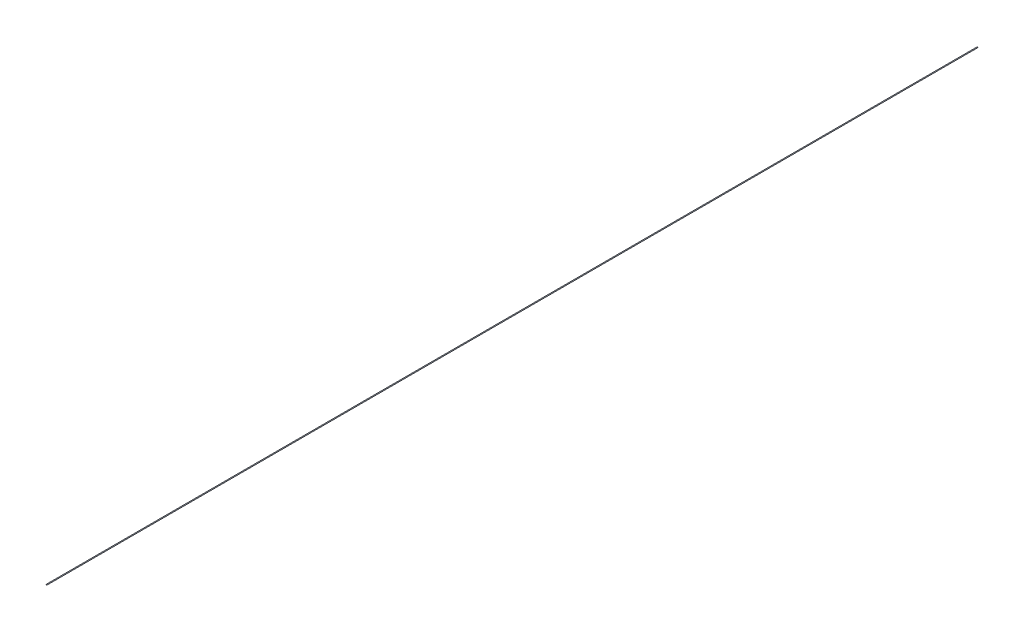
ISO-10303-21;
HEADER;
FILE_DESCRIPTION(('STEP AP214'),'2;1');
FILE_NAME('part.step','',(''),(''),'','','');
FILE_SCHEMA(('AUTOMOTIVE_DESIGN { 1 0 10303 214 1 1 1 1 }'));
ENDSEC;
DATA;
#1=APPLICATION_CONTEXT('core data for automotive mechanical design processes');
#2=APPLICATION_PROTOCOL_DEFINITION('international standard','automotive_design',2000,#1);
#3=PRODUCT_CONTEXT('',#1,'mechanical');
#4=PRODUCT('Part','Part','',(#3));
#5=PRODUCT_RELATED_PRODUCT_CATEGORY('part','',(#4));
#6=PRODUCT_DEFINITION_FORMATION('','',#4);
#7=PRODUCT_DEFINITION_CONTEXT('part definition',#1,'design');
#8=PRODUCT_DEFINITION('design','',#6,#7);
#9=PRODUCT_DEFINITION_SHAPE('','',#8);
#10=(LENGTH_UNIT() NAMED_UNIT(*) SI_UNIT(.MILLI.,.METRE.));
#11=(NAMED_UNIT(*) PLANE_ANGLE_UNIT() SI_UNIT($,.RADIAN.));
#12=(NAMED_UNIT(*) SI_UNIT($,.STERADIAN.) SOLID_ANGLE_UNIT());
#13=UNCERTAINTY_MEASURE_WITH_UNIT(LENGTH_MEASURE(1.E-05),#10,'distance_accuracy_value','');
#14=(GEOMETRIC_REPRESENTATION_CONTEXT(3) GLOBAL_UNCERTAINTY_ASSIGNED_CONTEXT((#13)) GLOBAL_UNIT_ASSIGNED_CONTEXT((#10,
#11,#12)) REPRESENTATION_CONTEXT('',''));
#15=CARTESIAN_POINT('',(0.,0.,0.));
#16=DIRECTION('',(0.,0.,1.));
#17=DIRECTION('',(1.,0.,0.));
#18=AXIS2_PLACEMENT_3D('',#15,#16,#17);
#19=CARTESIAN_POINT('',(0.,0.,7620.));
#20=DIRECTION('',(0.,0.,-1.));
#21=DIRECTION('',(-1.,0.,0.));
#22=AXIS2_PLACEMENT_3D('',#19,#20,#21);
#23=CYLINDRICAL_SURFACE('',#22,3.175);
#24=CARTESIAN_POINT('',(0.,0.,7620.));
#25=DIRECTION('',(0.,0.,1.));
#26=DIRECTION('',(1.,0.,0.));
#27=AXIS2_PLACEMENT_3D('',#24,#25,#26);
#28=CIRCLE('',#27,3.175);
#29=CARTESIAN_POINT('',(-3.175,0.,7620.));
#30=VERTEX_POINT('',#29);
#31=EDGE_CURVE('E10',#30,#30,#28,.T.);
#32=CARTESIAN_POINT('',(0.,0.,0.));
#33=DIRECTION('',(0.,0.,1.));
#34=DIRECTION('',(1.,0.,0.));
#35=AXIS2_PLACEMENT_3D('',#32,#33,#34);
#36=CIRCLE('',#35,3.175);
#37=CARTESIAN_POINT('',(-3.175,0.,-8.88178419700125E-13));
#38=VERTEX_POINT('',#37);
#39=EDGE_CURVE('E33',#38,#38,#36,.T.);
#40=CARTESIAN_POINT('',(-3.175,0.,7620.));
#41=CARTESIAN_POINT('',(-3.175,0.,7540.625));
#42=CARTESIAN_POINT('',(-3.175,0.,7461.25));
#43=CARTESIAN_POINT('',(-3.175,0.,7302.5));
#44=CARTESIAN_POINT('',(-3.175,0.,7223.125));
#45=CARTESIAN_POINT('',(-3.175,0.,7064.375));
#46=CARTESIAN_POINT('',(-3.175,0.,6985.));
#47=CARTESIAN_POINT('',(-3.175,0.,6826.25));
#48=CARTESIAN_POINT('',(-3.175,0.,6746.875));
#49=CARTESIAN_POINT('',(-3.175,0.,6588.125));
#50=CARTESIAN_POINT('',(-3.175,0.,6508.75));
#51=CARTESIAN_POINT('',(-3.175,0.,6350.));
#52=CARTESIAN_POINT('',(-3.175,0.,6270.625));
#53=CARTESIAN_POINT('',(-3.175,0.,6111.875));
#54=CARTESIAN_POINT('',(-3.175,0.,6032.5));
#55=CARTESIAN_POINT('',(-3.175,0.,5873.75));
#56=CARTESIAN_POINT('',(-3.175,0.,5794.375));
#57=CARTESIAN_POINT('',(-3.175,0.,5635.625));
#58=CARTESIAN_POINT('',(-3.175,0.,5556.25));
#59=CARTESIAN_POINT('',(-3.175,0.,5397.5));
#60=CARTESIAN_POINT('',(-3.175,0.,5318.125));
#61=CARTESIAN_POINT('',(-3.175,0.,5159.375));
#62=CARTESIAN_POINT('',(-3.175,0.,5080.));
#63=CARTESIAN_POINT('',(-3.175,0.,4921.25));
#64=CARTESIAN_POINT('',(-3.175,0.,4841.875));
#65=CARTESIAN_POINT('',(-3.175,0.,4683.125));
#66=CARTESIAN_POINT('',(-3.175,0.,4603.75));
#67=CARTESIAN_POINT('',(-3.175,0.,4445.));
#68=CARTESIAN_POINT('',(-3.175,0.,4365.625));
#69=CARTESIAN_POINT('',(-3.175,0.,4206.875));
#70=CARTESIAN_POINT('',(-3.175,0.,4127.5));
#71=CARTESIAN_POINT('',(-3.175,0.,3968.75));
#72=CARTESIAN_POINT('',(-3.175,0.,3889.375));
#73=CARTESIAN_POINT('',(-3.175,0.,3730.625));
#74=CARTESIAN_POINT('',(-3.175,0.,3651.25));
#75=CARTESIAN_POINT('',(-3.175,0.,3492.5));
#76=CARTESIAN_POINT('',(-3.175,0.,3413.125));
#77=CARTESIAN_POINT('',(-3.175,0.,3254.375));
#78=CARTESIAN_POINT('',(-3.175,0.,3175.));
#79=CARTESIAN_POINT('',(-3.175,0.,3016.25));
#80=CARTESIAN_POINT('',(-3.175,0.,2936.875));
#81=CARTESIAN_POINT('',(-3.175,0.,2778.125));
#82=CARTESIAN_POINT('',(-3.175,0.,2698.75));
#83=CARTESIAN_POINT('',(-3.175,0.,2540.));
#84=CARTESIAN_POINT('',(-3.175,0.,2460.625));
#85=CARTESIAN_POINT('',(-3.175,0.,2301.875));
#86=CARTESIAN_POINT('',(-3.175,0.,2222.5));
#87=CARTESIAN_POINT('',(-3.175,0.,2063.75));
#88=CARTESIAN_POINT('',(-3.175,0.,1984.375));
#89=CARTESIAN_POINT('',(-3.175,0.,1825.625));
#90=CARTESIAN_POINT('',(-3.175,0.,1746.25));
#91=CARTESIAN_POINT('',(-3.175,0.,1587.5));
#92=CARTESIAN_POINT('',(-3.175,0.,1508.125));
#93=CARTESIAN_POINT('',(-3.175,0.,1349.375));
#94=CARTESIAN_POINT('',(-3.175,0.,1270.));
#95=CARTESIAN_POINT('',(-3.175,0.,1111.25));
#96=CARTESIAN_POINT('',(-3.175,0.,1031.875));
#97=CARTESIAN_POINT('',(-3.175,0.,873.125));
#98=CARTESIAN_POINT('',(-3.175,0.,793.75));
#99=CARTESIAN_POINT('',(-3.175,0.,635.));
#100=CARTESIAN_POINT('',(-3.175,0.,555.624999999999));
#101=CARTESIAN_POINT('',(-3.175,0.,396.874999999999));
#102=CARTESIAN_POINT('',(-3.175,0.,317.499999999999));
#103=CARTESIAN_POINT('',(-3.175,0.,158.749999999999));
#104=CARTESIAN_POINT('',(-3.175,0.,79.3749999999992));
#105=CARTESIAN_POINT('',(-3.175,0.,-8.88178419700125E-13));
#106=B_SPLINE_CURVE_WITH_KNOTS('',3,(#40,#41,#42,#43,#44,#45,#46,#47,#48,#49,#50,#51,#52,#53,
#54,#55,#56,#57,#58,#59,#60,#61,#62,#63,#64,#65,#66,#67,#68,#69,#70,#71,#72,#73,#74,#75,#76,#77,
#78,#79,#80,#81,#82,#83,#84,#85,#86,#87,#88,#89,#90,#91,#92,#93,#94,#95,#96,#97,#98,#99,#100,
#101,#102,#103,#104,#105),.UNSPECIFIED.,.F.,.F.,(4,2,2,2,2,2,2,2,2,2,2,2,2,2,2,2,2,2,2,2,2,2,2,
2,2,2,2,2,2,2,2,2,4),(0.,238.124999999999,476.249999999999,714.375,952.5,1190.625,1428.75,
1666.875,1905.,2143.125,2381.25,2619.375,2857.5,3095.625,3333.75,3571.875,3810.,4048.125,
4286.25,4524.375,4762.5,5000.625,5238.75,5476.875,5715.,5953.125,6191.25,6429.375,6667.5,
6905.625,7143.75,7381.875,7620.),.UNSPECIFIED.);
#107=EDGE_CURVE('BSEAM30',#30,#38,#106,.T.);
#108=ORIENTED_EDGE('',*,*,#31,.F.);
#109=ORIENTED_EDGE('',*,*,#39,.T.);
#110=ORIENTED_EDGE('',*,*,#107,.T.);
#111=ORIENTED_EDGE('',*,*,#107,.F.);
#112=EDGE_LOOP('',(#108,#110,#109,#111));
#113=FACE_BOUND('',#112,.T.);
#114=ADVANCED_FACE('F30',(#113),#23,.T.);
#115=CARTESIAN_POINT('',(0.,0.,7620.));
#116=DIRECTION('',(0.,0.,1.));
#117=DIRECTION('',(1.,0.,0.));
#118=AXIS2_PLACEMENT_3D('',#115,#116,#117);
#119=PLANE('',#118);
#120=ORIENTED_EDGE('',*,*,#31,.T.);
#121=EDGE_LOOP('',(#120));
#122=FACE_BOUND('',#121,.T.);
#123=ADVANCED_FACE('F45',(#122),#119,.T.);
#124=CARTESIAN_POINT('',(0.,0.,0.));
#125=DIRECTION('',(0.,0.,1.));
#126=DIRECTION('',(1.,0.,0.));
#127=AXIS2_PLACEMENT_3D('',#124,#125,#126);
#128=PLANE('',#127);
#129=ORIENTED_EDGE('',*,*,#39,.F.);
#130=EDGE_LOOP('',(#129));
#131=FACE_BOUND('',#130,.T.);
#132=ADVANCED_FACE('F43',(#131),#128,.F.);
#133=CLOSED_SHELL('',(#114,#123,#132));
#134=MANIFOLD_SOLID_BREP('B2',#133);
#135=ADVANCED_BREP_SHAPE_REPRESENTATION('',(#18,#134),#14);
#136=SHAPE_DEFINITION_REPRESENTATION(#9,#135);
ENDSEC;
END-ISO-10303-21;
